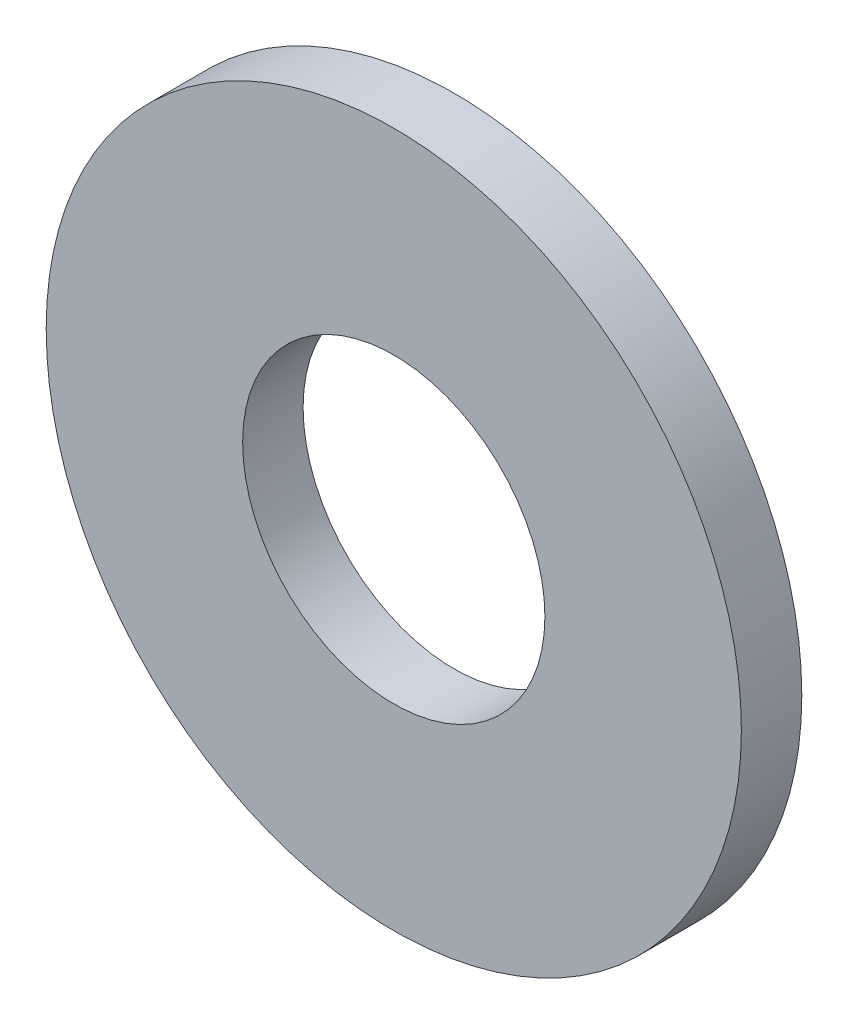
ISO-10303-21;
HEADER;
FILE_DESCRIPTION(('STEP AP214'),'2;1');
FILE_NAME('part.step','',(''),(''),'','','');
FILE_SCHEMA(('AUTOMOTIVE_DESIGN { 1 0 10303 214 1 1 1 1 }'));
ENDSEC;
DATA;
#1=APPLICATION_CONTEXT('core data for automotive mechanical design processes');
#2=APPLICATION_PROTOCOL_DEFINITION('international standard','automotive_design',2000,#1);
#3=PRODUCT_CONTEXT('',#1,'mechanical');
#4=PRODUCT('Part','Part','',(#3));
#5=PRODUCT_RELATED_PRODUCT_CATEGORY('part','',(#4));
#6=PRODUCT_DEFINITION_FORMATION('','',#4);
#7=PRODUCT_DEFINITION_CONTEXT('part definition',#1,'design');
#8=PRODUCT_DEFINITION('design','',#6,#7);
#9=PRODUCT_DEFINITION_SHAPE('','',#8);
#10=(LENGTH_UNIT() NAMED_UNIT(*) SI_UNIT(.MILLI.,.METRE.));
#11=(NAMED_UNIT(*) PLANE_ANGLE_UNIT() SI_UNIT($,.RADIAN.));
#12=(NAMED_UNIT(*) SI_UNIT($,.STERADIAN.) SOLID_ANGLE_UNIT());
#13=UNCERTAINTY_MEASURE_WITH_UNIT(LENGTH_MEASURE(1.E-05),#10,'distance_accuracy_value','');
#14=(GEOMETRIC_REPRESENTATION_CONTEXT(3) GLOBAL_UNCERTAINTY_ASSIGNED_CONTEXT((#13)) GLOBAL_UNIT_ASSIGNED_CONTEXT((#10,
#11,#12)) REPRESENTATION_CONTEXT('',''));
#15=CARTESIAN_POINT('',(0.,0.,0.));
#16=DIRECTION('',(0.,0.,1.));
#17=DIRECTION('',(1.,0.,0.));
#18=AXIS2_PLACEMENT_3D('',#15,#16,#17);
#19=CARTESIAN_POINT('',(0.,0.,1.));
#20=DIRECTION('',(0.,0.,1.));
#21=DIRECTION('',(1.,0.,0.));
#22=AXIS2_PLACEMENT_3D('',#19,#20,#21);
#23=PLANE('',#22);
#24=CARTESIAN_POINT('',(0.,0.,1.));
#25=DIRECTION('',(0.,0.,1.));
#26=DIRECTION('',(1.,0.,0.));
#27=AXIS2_PLACEMENT_3D('',#24,#25,#26);
#28=CIRCLE('',#27,5.75);
#29=CARTESIAN_POINT('',(5.75,0.,1.));
#30=VERTEX_POINT('',#29);
#31=EDGE_CURVE('E10',#30,#30,#28,.T.);
#32=ORIENTED_EDGE('',*,*,#31,.T.);
#33=EDGE_LOOP('',(#32));
#34=FACE_BOUND('',#33,.T.);
#35=CARTESIAN_POINT('',(0.,0.,1.));
#36=DIRECTION('',(0.,0.,1.));
#37=DIRECTION('',(1.,0.,0.));
#38=AXIS2_PLACEMENT_3D('',#35,#36,#37);
#39=CIRCLE('',#38,2.5);
#40=CARTESIAN_POINT('',(2.5,0.,1.));
#41=VERTEX_POINT('',#40);
#42=EDGE_CURVE('E42',#41,#41,#39,.T.);
#43=ORIENTED_EDGE('',*,*,#42,.F.);
#44=EDGE_LOOP('',(#43));
#45=FACE_BOUND('',#44,.T.);
#46=ADVANCED_FACE('F31',(#34,#45),#23,.T.);
#47=CARTESIAN_POINT('',(0.,0.,0.));
#48=DIRECTION('',(0.,0.,1.));
#49=DIRECTION('',(1.,0.,0.));
#50=AXIS2_PLACEMENT_3D('',#47,#48,#49);
#51=PLANE('',#50);
#52=CARTESIAN_POINT('',(0.,0.,0.));
#53=DIRECTION('',(0.,0.,1.));
#54=DIRECTION('',(1.,0.,0.));
#55=AXIS2_PLACEMENT_3D('',#52,#53,#54);
#56=CIRCLE('',#55,5.75);
#57=CARTESIAN_POINT('',(5.75,0.,0.));
#58=VERTEX_POINT('',#57);
#59=EDGE_CURVE('E35',#58,#58,#56,.T.);
#60=ORIENTED_EDGE('',*,*,#59,.F.);
#61=EDGE_LOOP('',(#60));
#62=FACE_BOUND('',#61,.T.);
#63=CARTESIAN_POINT('',(0.,0.,0.));
#64=DIRECTION('',(0.,0.,1.));
#65=DIRECTION('',(1.,0.,0.));
#66=AXIS2_PLACEMENT_3D('',#63,#64,#65);
#67=CIRCLE('',#66,2.5);
#68=CARTESIAN_POINT('',(2.5,0.,0.));
#69=VERTEX_POINT('',#68);
#70=EDGE_CURVE('E44',#69,#69,#67,.T.);
#71=ORIENTED_EDGE('',*,*,#70,.T.);
#72=EDGE_LOOP('',(#71));
#73=FACE_BOUND('',#72,.T.);
#74=ADVANCED_FACE('F54',(#62,#73),#51,.F.);
#75=CARTESIAN_POINT('',(0.,0.,1.));
#76=DIRECTION('',(0.,0.,-1.));
#77=DIRECTION('',(-1.,0.,0.));
#78=AXIS2_PLACEMENT_3D('',#75,#76,#77);
#79=CYLINDRICAL_SURFACE('',#78,5.75);
#80=ORIENTED_EDGE('',*,*,#31,.F.);
#81=EDGE_LOOP('',(#80));
#82=FACE_BOUND('',#81,.T.);
#83=ORIENTED_EDGE('',*,*,#59,.T.);
#84=EDGE_LOOP('',(#83));
#85=FACE_BOUND('',#84,.T.);
#86=ADVANCED_FACE('F33',(#82,#85),#79,.T.);
#87=CARTESIAN_POINT('',(0.,0.,1.));
#88=DIRECTION('',(0.,0.,-1.));
#89=DIRECTION('',(-1.,0.,0.));
#90=AXIS2_PLACEMENT_3D('',#87,#88,#89);
#91=CYLINDRICAL_SURFACE('',#90,2.5);
#92=ORIENTED_EDGE('',*,*,#42,.T.);
#93=EDGE_LOOP('',(#92));
#94=FACE_BOUND('',#93,.T.);
#95=ORIENTED_EDGE('',*,*,#70,.F.);
#96=EDGE_LOOP('',(#95));
#97=FACE_BOUND('',#96,.T.);
#98=ADVANCED_FACE('F50',(#94,#97),#91,.F.);
#99=CLOSED_SHELL('',(#46,#74,#86,#98));
#100=MANIFOLD_SOLID_BREP('B2',#99);
#101=ADVANCED_BREP_SHAPE_REPRESENTATION('',(#18,#100),#14);
#102=SHAPE_DEFINITION_REPRESENTATION(#9,#101);
ENDSEC;
END-ISO-10303-21;
